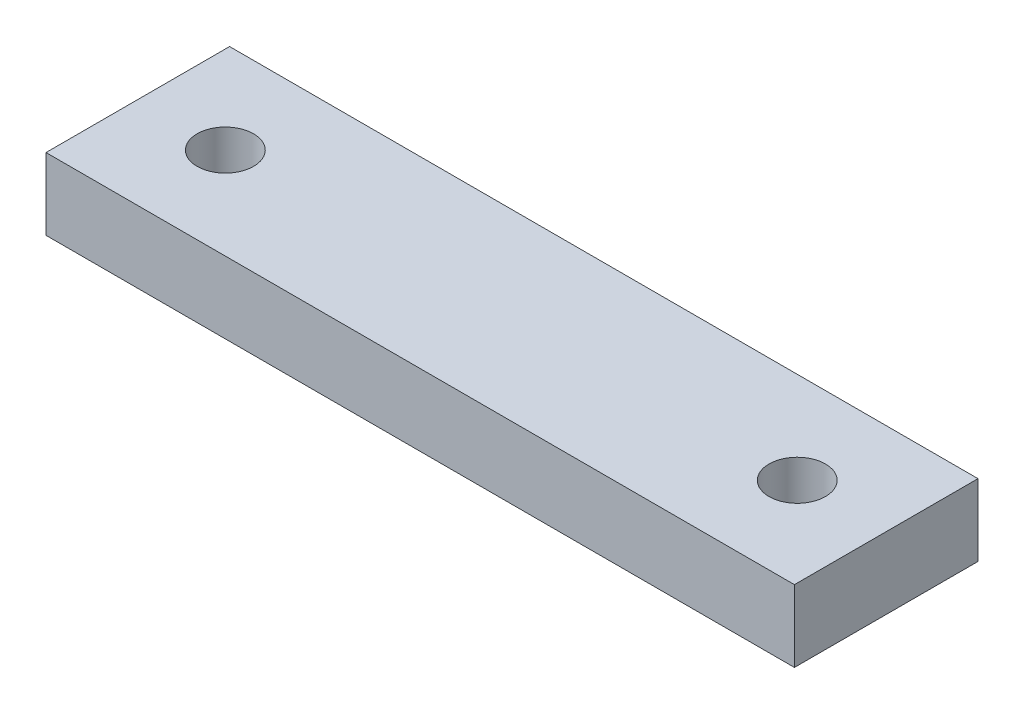
ISO-10303-21;
HEADER;
FILE_DESCRIPTION(('STEP AP214'),'2;1');
FILE_NAME('part.step','',(''),(''),'','','');
FILE_SCHEMA(('AUTOMOTIVE_DESIGN { 1 0 10303 214 1 1 1 1 }'));
ENDSEC;
DATA;
#1=APPLICATION_CONTEXT('core data for automotive mechanical design processes');
#2=APPLICATION_PROTOCOL_DEFINITION('international standard','automotive_design',2000,#1);
#3=PRODUCT_CONTEXT('',#1,'mechanical');
#4=PRODUCT('Part','Part','',(#3));
#5=PRODUCT_RELATED_PRODUCT_CATEGORY('part','',(#4));
#6=PRODUCT_DEFINITION_FORMATION('','',#4);
#7=PRODUCT_DEFINITION_CONTEXT('part definition',#1,'design');
#8=PRODUCT_DEFINITION('design','',#6,#7);
#9=PRODUCT_DEFINITION_SHAPE('','',#8);
#10=(LENGTH_UNIT() NAMED_UNIT(*) SI_UNIT(.MILLI.,.METRE.));
#11=(NAMED_UNIT(*) PLANE_ANGLE_UNIT() SI_UNIT($,.RADIAN.));
#12=(NAMED_UNIT(*) SI_UNIT($,.STERADIAN.) SOLID_ANGLE_UNIT());
#13=UNCERTAINTY_MEASURE_WITH_UNIT(LENGTH_MEASURE(1.E-05),#10,'distance_accuracy_value','');
#14=(GEOMETRIC_REPRESENTATION_CONTEXT(3) GLOBAL_UNCERTAINTY_ASSIGNED_CONTEXT((#13)) GLOBAL_UNIT_ASSIGNED_CONTEXT((#10,
#11,#12)) REPRESENTATION_CONTEXT('',''));
#15=CARTESIAN_POINT('',(0.,0.,0.));
#16=DIRECTION('',(0.,0.,1.));
#17=DIRECTION('',(1.,0.,0.));
#18=AXIS2_PLACEMENT_3D('',#15,#16,#17);
#19=CARTESIAN_POINT('',(0.,2.54,0.));
#20=DIRECTION('',(0.,-1.,0.));
#21=DIRECTION('',(0.,0.,-1.));
#22=AXIS2_PLACEMENT_3D('',#19,#20,#21);
#23=PLANE('',#22);
#24=DIRECTION('',(0.,0.,1.));
#25=VECTOR('',#24,1.);
#26=CARTESIAN_POINT('',(0.,2.54,0.));
#27=LINE('',#26,#25);
#28=CARTESIAN_POINT('',(0.,2.54,-6.5));
#29=VERTEX_POINT('',#28);
#30=CARTESIAN_POINT('',(0.,2.54,0.));
#31=VERTEX_POINT('',#30);
#32=EDGE_CURVE('E93',#29,#31,#27,.T.);
#33=ORIENTED_EDGE('',*,*,#32,.T.);
#34=DIRECTION('',(1.,0.,0.));
#35=VECTOR('',#34,1.);
#36=CARTESIAN_POINT('',(0.,2.54,0.));
#37=LINE('',#36,#35);
#38=CARTESIAN_POINT('',(26.5,2.54,0.));
#39=VERTEX_POINT('',#38);
#40=EDGE_CURVE('E88',#31,#39,#37,.T.);
#41=ORIENTED_EDGE('',*,*,#40,.T.);
#42=DIRECTION('',(0.,0.,-1.));
#43=VECTOR('',#42,1.);
#44=CARTESIAN_POINT('',(26.5,2.54,0.));
#45=LINE('',#44,#43);
#46=CARTESIAN_POINT('',(26.5,2.54,-6.5));
#47=VERTEX_POINT('',#46);
#48=EDGE_CURVE('E91',#39,#47,#45,.T.);
#49=ORIENTED_EDGE('',*,*,#48,.T.);
#50=DIRECTION('',(-1.,0.,0.));
#51=VECTOR('',#50,1.);
#52=CARTESIAN_POINT('',(0.,2.54,-6.5));
#53=LINE('',#52,#51);
#54=EDGE_CURVE('E58',#47,#29,#53,.T.);
#55=ORIENTED_EDGE('',*,*,#54,.T.);
#56=EDGE_LOOP('',(#33,#41,#49,#55));
#57=FACE_BOUND('',#56,.T.);
#58=CARTESIAN_POINT('',(3.1,2.54,-3.25));
#59=DIRECTION('',(0.,1.,0.));
#60=DIRECTION('',(0.,0.,1.));
#61=AXIS2_PLACEMENT_3D('',#58,#59,#60);
#62=CIRCLE('',#61,1.);
#63=CARTESIAN_POINT('',(3.1,2.54,-2.25));
#64=VERTEX_POINT('',#63);
#65=EDGE_CURVE('E108',#64,#64,#62,.T.);
#66=ORIENTED_EDGE('',*,*,#65,.F.);
#67=EDGE_LOOP('',(#66));
#68=FACE_BOUND('',#67,.T.);
#69=CARTESIAN_POINT('',(23.35,2.54,-3.25));
#70=DIRECTION('',(0.,1.,0.));
#71=DIRECTION('',(0.,0.,1.));
#72=AXIS2_PLACEMENT_3D('',#69,#70,#71);
#73=CIRCLE('',#72,1.);
#74=CARTESIAN_POINT('',(23.35,2.54,-2.25));
#75=VERTEX_POINT('',#74);
#76=EDGE_CURVE('E123',#75,#75,#73,.T.);
#77=ORIENTED_EDGE('',*,*,#76,.F.);
#78=EDGE_LOOP('',(#77));
#79=FACE_BOUND('',#78,.T.);
#80=ADVANCED_FACE('F41',(#57,#68,#79),#23,.F.);
#81=CARTESIAN_POINT('',(0.,0.,0.));
#82=DIRECTION('',(0.,-1.,0.));
#83=DIRECTION('',(0.,0.,-1.));
#84=AXIS2_PLACEMENT_3D('',#81,#82,#83);
#85=PLANE('',#84);
#86=CARTESIAN_POINT('',(3.1,0.,-3.25));
#87=DIRECTION('',(0.,1.,0.));
#88=DIRECTION('',(0.,0.,1.));
#89=AXIS2_PLACEMENT_3D('',#86,#87,#88);
#90=CIRCLE('',#89,1.);
#91=CARTESIAN_POINT('',(3.1,0.,-2.25));
#92=VERTEX_POINT('',#91);
#93=EDGE_CURVE('E120',#92,#92,#90,.T.);
#94=ORIENTED_EDGE('',*,*,#93,.T.);
#95=EDGE_LOOP('',(#94));
#96=FACE_BOUND('',#95,.T.);
#97=DIRECTION('',(0.,0.,1.));
#98=VECTOR('',#97,1.);
#99=CARTESIAN_POINT('',(0.,0.,0.));
#100=LINE('',#99,#98);
#101=CARTESIAN_POINT('',(0.,0.,-6.5));
#102=VERTEX_POINT('',#101);
#103=CARTESIAN_POINT('',(0.,0.,0.));
#104=VERTEX_POINT('',#103);
#105=EDGE_CURVE('E105',#102,#104,#100,.T.);
#106=ORIENTED_EDGE('',*,*,#105,.F.);
#107=DIRECTION('',(-1.,0.,0.));
#108=VECTOR('',#107,1.);
#109=CARTESIAN_POINT('',(0.,0.,-6.5));
#110=LINE('',#109,#108);
#111=CARTESIAN_POINT('',(26.5,0.,-6.5));
#112=VERTEX_POINT('',#111);
#113=EDGE_CURVE('E81',#112,#102,#110,.T.);
#114=ORIENTED_EDGE('',*,*,#113,.F.);
#115=DIRECTION('',(0.,0.,-1.));
#116=VECTOR('',#115,1.);
#117=CARTESIAN_POINT('',(26.5,0.,0.));
#118=LINE('',#117,#116);
#119=CARTESIAN_POINT('',(26.5,0.,0.));
#120=VERTEX_POINT('',#119);
#121=EDGE_CURVE('E75',#120,#112,#118,.T.);
#122=ORIENTED_EDGE('',*,*,#121,.F.);
#123=DIRECTION('',(1.,0.,0.));
#124=VECTOR('',#123,1.);
#125=CARTESIAN_POINT('',(0.,0.,0.));
#126=LINE('',#125,#124);
#127=EDGE_CURVE('E97',#104,#120,#126,.T.);
#128=ORIENTED_EDGE('',*,*,#127,.F.);
#129=EDGE_LOOP('',(#106,#114,#122,#128));
#130=FACE_BOUND('',#129,.T.);
#131=CARTESIAN_POINT('',(23.35,0.,-3.25));
#132=DIRECTION('',(0.,1.,0.));
#133=DIRECTION('',(0.,0.,1.));
#134=AXIS2_PLACEMENT_3D('',#131,#132,#133);
#135=CIRCLE('',#134,1.);
#136=CARTESIAN_POINT('',(23.35,0.,-2.25));
#137=VERTEX_POINT('',#136);
#138=EDGE_CURVE('E126',#137,#137,#135,.T.);
#139=ORIENTED_EDGE('',*,*,#138,.T.);
#140=EDGE_LOOP('',(#139));
#141=FACE_BOUND('',#140,.T.);
#142=ADVANCED_FACE('F116',(#96,#130,#141),#85,.T.);
#143=CARTESIAN_POINT('',(0.,2.54,0.));
#144=DIRECTION('',(1.,0.,0.));
#145=DIRECTION('',(0.,0.,-1.));
#146=AXIS2_PLACEMENT_3D('',#143,#144,#145);
#147=PLANE('',#146);
#148=ORIENTED_EDGE('',*,*,#105,.T.);
#149=DIRECTION('',(0.,-1.,0.));
#150=VECTOR('',#149,1.);
#151=CARTESIAN_POINT('',(0.,2.54,0.));
#152=LINE('',#151,#150);
#153=EDGE_CURVE('E11',#31,#104,#152,.T.);
#154=ORIENTED_EDGE('',*,*,#153,.F.);
#155=ORIENTED_EDGE('',*,*,#32,.F.);
#156=DIRECTION('',(0.,-1.,0.));
#157=VECTOR('',#156,1.);
#158=CARTESIAN_POINT('',(0.,2.54,-6.5));
#159=LINE('',#158,#157);
#160=EDGE_CURVE('E101',#29,#102,#159,.T.);
#161=ORIENTED_EDGE('',*,*,#160,.T.);
#162=EDGE_LOOP('',(#148,#154,#155,#161));
#163=FACE_BOUND('',#162,.T.);
#164=ADVANCED_FACE('F43',(#163),#147,.F.);
#165=CARTESIAN_POINT('',(0.,2.54,0.));
#166=DIRECTION('',(0.,0.,-1.));
#167=DIRECTION('',(-1.,0.,0.));
#168=AXIS2_PLACEMENT_3D('',#165,#166,#167);
#169=PLANE('',#168);
#170=ORIENTED_EDGE('',*,*,#127,.T.);
#171=DIRECTION('',(0.,-1.,0.));
#172=VECTOR('',#171,1.);
#173=CARTESIAN_POINT('',(26.5,2.54,0.));
#174=LINE('',#173,#172);
#175=EDGE_CURVE('E50',#39,#120,#174,.T.);
#176=ORIENTED_EDGE('',*,*,#175,.F.);
#177=ORIENTED_EDGE('',*,*,#40,.F.);
#178=ORIENTED_EDGE('',*,*,#153,.T.);
#179=EDGE_LOOP('',(#170,#176,#177,#178));
#180=FACE_BOUND('',#179,.T.);
#181=ADVANCED_FACE('F96',(#180),#169,.F.);
#182=CARTESIAN_POINT('',(26.5,2.54,0.));
#183=DIRECTION('',(-1.,0.,0.));
#184=DIRECTION('',(0.,0.,1.));
#185=AXIS2_PLACEMENT_3D('',#182,#183,#184);
#186=PLANE('',#185);
#187=ORIENTED_EDGE('',*,*,#121,.T.);
#188=DIRECTION('',(0.,-1.,0.));
#189=VECTOR('',#188,1.);
#190=CARTESIAN_POINT('',(26.5,2.54,-6.5));
#191=LINE('',#190,#189);
#192=EDGE_CURVE('E98',#47,#112,#191,.T.);
#193=ORIENTED_EDGE('',*,*,#192,.F.);
#194=ORIENTED_EDGE('',*,*,#48,.F.);
#195=ORIENTED_EDGE('',*,*,#175,.T.);
#196=EDGE_LOOP('',(#187,#193,#194,#195));
#197=FACE_BOUND('',#196,.T.);
#198=ADVANCED_FACE('F99',(#197),#186,.F.);
#199=CARTESIAN_POINT('',(0.,2.54,-6.5));
#200=DIRECTION('',(0.,0.,1.));
#201=DIRECTION('',(1.,0.,0.));
#202=AXIS2_PLACEMENT_3D('',#199,#200,#201);
#203=PLANE('',#202);
#204=ORIENTED_EDGE('',*,*,#113,.T.);
#205=ORIENTED_EDGE('',*,*,#160,.F.);
#206=ORIENTED_EDGE('',*,*,#54,.F.);
#207=ORIENTED_EDGE('',*,*,#192,.T.);
#208=EDGE_LOOP('',(#204,#205,#206,#207));
#209=FACE_BOUND('',#208,.T.);
#210=ADVANCED_FACE('F113',(#209),#203,.F.);
#211=CARTESIAN_POINT('',(3.1,2.54,-3.25));
#212=DIRECTION('',(0.,-1.,0.));
#213=DIRECTION('',(0.,0.,-1.));
#214=AXIS2_PLACEMENT_3D('',#211,#212,#213);
#215=CYLINDRICAL_SURFACE('',#214,1.);
#216=ORIENTED_EDGE('',*,*,#65,.T.);
#217=EDGE_LOOP('',(#216));
#218=FACE_BOUND('',#217,.T.);
#219=ORIENTED_EDGE('',*,*,#93,.F.);
#220=EDGE_LOOP('',(#219));
#221=FACE_BOUND('',#220,.T.);
#222=ADVANCED_FACE('F143',(#218,#221),#215,.F.);
#223=CARTESIAN_POINT('',(23.35,2.54,-3.25));
#224=DIRECTION('',(0.,-1.,0.));
#225=DIRECTION('',(0.,0.,-1.));
#226=AXIS2_PLACEMENT_3D('',#223,#224,#225);
#227=CYLINDRICAL_SURFACE('',#226,1.);
#228=ORIENTED_EDGE('',*,*,#76,.T.);
#229=EDGE_LOOP('',(#228));
#230=FACE_BOUND('',#229,.T.);
#231=ORIENTED_EDGE('',*,*,#138,.F.);
#232=EDGE_LOOP('',(#231));
#233=FACE_BOUND('',#232,.T.);
#234=ADVANCED_FACE('F132',(#230,#233),#227,.F.);
#235=CLOSED_SHELL('',(#80,#142,#164,#181,#198,#210,#222,#234));
#236=MANIFOLD_SOLID_BREP('B2',#235);
#237=ADVANCED_BREP_SHAPE_REPRESENTATION('',(#18,#236),#14);
#238=SHAPE_DEFINITION_REPRESENTATION(#9,#237);
ENDSEC;
END-ISO-10303-21;
